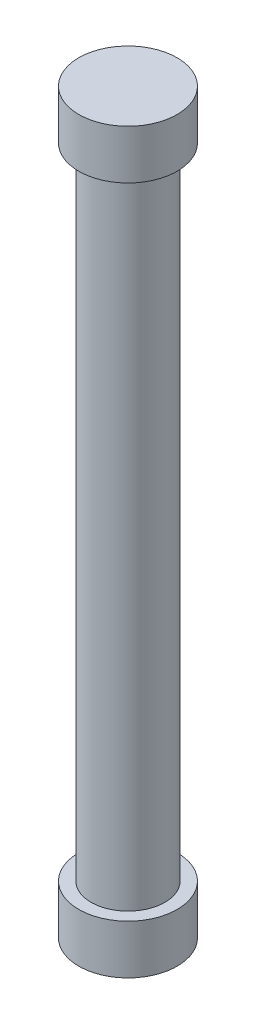
ISO-10303-21;
HEADER;
FILE_DESCRIPTION(('STEP AP214'),'2;1');
FILE_NAME('part.step','',(''),(''),'','','');
FILE_SCHEMA(('AUTOMOTIVE_DESIGN { 1 0 10303 214 1 1 1 1 }'));
ENDSEC;
DATA;
#1=APPLICATION_CONTEXT('core data for automotive mechanical design processes');
#2=APPLICATION_PROTOCOL_DEFINITION('international standard','automotive_design',2000,#1);
#3=PRODUCT_CONTEXT('',#1,'mechanical');
#4=PRODUCT('Part','Part','',(#3));
#5=PRODUCT_RELATED_PRODUCT_CATEGORY('part','',(#4));
#6=PRODUCT_DEFINITION_FORMATION('','',#4);
#7=PRODUCT_DEFINITION_CONTEXT('part definition',#1,'design');
#8=PRODUCT_DEFINITION('design','',#6,#7);
#9=PRODUCT_DEFINITION_SHAPE('','',#8);
#10=(LENGTH_UNIT() NAMED_UNIT(*) SI_UNIT(.MILLI.,.METRE.));
#11=(NAMED_UNIT(*) PLANE_ANGLE_UNIT() SI_UNIT($,.RADIAN.));
#12=(NAMED_UNIT(*) SI_UNIT($,.STERADIAN.) SOLID_ANGLE_UNIT());
#13=UNCERTAINTY_MEASURE_WITH_UNIT(LENGTH_MEASURE(1.E-05),#10,'distance_accuracy_value','');
#14=(GEOMETRIC_REPRESENTATION_CONTEXT(3) GLOBAL_UNCERTAINTY_ASSIGNED_CONTEXT((#13)) GLOBAL_UNIT_ASSIGNED_CONTEXT((#10,
#11,#12)) REPRESENTATION_CONTEXT('',''));
#15=CARTESIAN_POINT('',(0.,0.,0.));
#16=DIRECTION('',(0.,0.,1.));
#17=DIRECTION('',(1.,0.,0.));
#18=AXIS2_PLACEMENT_3D('',#15,#16,#17);
#19=CARTESIAN_POINT('',(-2.,26.025205425851,0.));
#20=DIRECTION('',(0.,1.,0.));
#21=DIRECTION('',(-1.,0.,0.));
#22=AXIS2_PLACEMENT_3D('',#19,#20,#21);
#23=PLANE('',#22);
#24=CARTESIAN_POINT('',(0.,26.025205425851,0.));
#25=DIRECTION('',(0.,1.,0.));
#26=DIRECTION('',(-1.,0.,0.));
#27=AXIS2_PLACEMENT_3D('',#24,#25,#26);
#28=CIRCLE('',#27,2.);
#29=CARTESIAN_POINT('',(-2.,26.025205425851,0.));
#30=VERTEX_POINT('',#29);
#31=EDGE_CURVE('E64',#30,#30,#28,.T.);
#32=ORIENTED_EDGE('',*,*,#31,.T.);
#33=EDGE_LOOP('',(#32));
#34=FACE_BOUND('',#33,.T.);
#35=ADVANCED_FACE('F37',(#34),#23,.T.);
#36=CARTESIAN_POINT('',(0.,-3.97479457414895,0.));
#37=DIRECTION('',(0.,-1.,0.));
#38=DIRECTION('',(1.,0.,0.));
#39=AXIS2_PLACEMENT_3D('',#36,#37,#38);
#40=PLANE('',#39);
#41=CARTESIAN_POINT('',(0.,-3.97479457414895,0.));
#42=DIRECTION('',(0.,1.,0.));
#43=DIRECTION('',(-1.,0.,0.));
#44=AXIS2_PLACEMENT_3D('',#41,#42,#43);
#45=CIRCLE('',#44,2.);
#46=CARTESIAN_POINT('',(-2.,-3.97479457414895,0.));
#47=VERTEX_POINT('',#46);
#48=EDGE_CURVE('E10',#47,#47,#45,.T.);
#49=ORIENTED_EDGE('',*,*,#48,.F.);
#50=EDGE_LOOP('',(#49));
#51=FACE_BOUND('',#50,.T.);
#52=ADVANCED_FACE('F82',(#51),#40,.T.);
#53=CARTESIAN_POINT('',(0.,26.025205425851,0.));
#54=DIRECTION('',(0.,1.,0.));
#55=DIRECTION('',(-1.,0.,0.));
#56=AXIS2_PLACEMENT_3D('',#53,#54,#55);
#57=CYLINDRICAL_SURFACE('',#56,2.);
#58=ORIENTED_EDGE('',*,*,#48,.T.);
#59=EDGE_LOOP('',(#58));
#60=FACE_BOUND('',#59,.T.);
#61=CARTESIAN_POINT('',(0.,-1.97479457414895,0.));
#62=DIRECTION('',(0.,1.,0.));
#63=DIRECTION('',(-1.,0.,0.));
#64=AXIS2_PLACEMENT_3D('',#61,#62,#63);
#65=CIRCLE('',#64,2.);
#66=CARTESIAN_POINT('',(-2.,-1.97479457414895,0.));
#67=VERTEX_POINT('',#66);
#68=EDGE_CURVE('E44',#67,#67,#65,.T.);
#69=ORIENTED_EDGE('',*,*,#68,.F.);
#70=EDGE_LOOP('',(#69));
#71=FACE_BOUND('',#70,.T.);
#72=ADVANCED_FACE('F86',(#60,#71),#57,.T.);
#73=CARTESIAN_POINT('',(-2.,-1.97479457414895,0.));
#74=DIRECTION('',(0.,1.,0.));
#75=DIRECTION('',(-1.,0.,0.));
#76=AXIS2_PLACEMENT_3D('',#73,#74,#75);
#77=PLANE('',#76);
#78=ORIENTED_EDGE('',*,*,#68,.T.);
#79=EDGE_LOOP('',(#78));
#80=FACE_BOUND('',#79,.T.);
#81=CARTESIAN_POINT('',(0.,-1.97479457414895,0.));
#82=DIRECTION('',(0.,1.,0.));
#83=DIRECTION('',(-1.,0.,0.));
#84=AXIS2_PLACEMENT_3D('',#81,#82,#83);
#85=CIRCLE('',#84,1.5);
#86=CARTESIAN_POINT('',(-1.5,-1.97479457414895,0.));
#87=VERTEX_POINT('',#86);
#88=EDGE_CURVE('E49',#87,#87,#85,.T.);
#89=ORIENTED_EDGE('',*,*,#88,.F.);
#90=EDGE_LOOP('',(#89));
#91=FACE_BOUND('',#90,.T.);
#92=ADVANCED_FACE('F91',(#80,#91),#77,.T.);
#93=CARTESIAN_POINT('',(0.,26.025205425851,0.));
#94=DIRECTION('',(0.,1.,0.));
#95=DIRECTION('',(-1.,0.,0.));
#96=AXIS2_PLACEMENT_3D('',#93,#94,#95);
#97=CYLINDRICAL_SURFACE('',#96,1.5);
#98=ORIENTED_EDGE('',*,*,#88,.T.);
#99=EDGE_LOOP('',(#98));
#100=FACE_BOUND('',#99,.T.);
#101=CARTESIAN_POINT('',(0.,24.025205425851,0.));
#102=DIRECTION('',(0.,1.,0.));
#103=DIRECTION('',(-1.,0.,0.));
#104=AXIS2_PLACEMENT_3D('',#101,#102,#103);
#105=CIRCLE('',#104,1.5);
#106=CARTESIAN_POINT('',(-1.5,24.025205425851,0.));
#107=VERTEX_POINT('',#106);
#108=EDGE_CURVE('E54',#107,#107,#105,.T.);
#109=ORIENTED_EDGE('',*,*,#108,.F.);
#110=EDGE_LOOP('',(#109));
#111=FACE_BOUND('',#110,.T.);
#112=ADVANCED_FACE('F78',(#100,#111),#97,.T.);
#113=CARTESIAN_POINT('',(-1.5,24.025205425851,0.));
#114=DIRECTION('',(0.,-1.,0.));
#115=DIRECTION('',(1.,0.,0.));
#116=AXIS2_PLACEMENT_3D('',#113,#114,#115);
#117=PLANE('',#116);
#118=ORIENTED_EDGE('',*,*,#108,.T.);
#119=EDGE_LOOP('',(#118));
#120=FACE_BOUND('',#119,.T.);
#121=CARTESIAN_POINT('',(0.,24.025205425851,0.));
#122=DIRECTION('',(0.,1.,0.));
#123=DIRECTION('',(-1.,0.,0.));
#124=AXIS2_PLACEMENT_3D('',#121,#122,#123);
#125=CIRCLE('',#124,2.);
#126=CARTESIAN_POINT('',(-2.,24.025205425851,0.));
#127=VERTEX_POINT('',#126);
#128=EDGE_CURVE('E60',#127,#127,#125,.T.);
#129=ORIENTED_EDGE('',*,*,#128,.F.);
#130=EDGE_LOOP('',(#129));
#131=FACE_BOUND('',#130,.T.);
#132=ADVANCED_FACE('F72',(#120,#131),#117,.T.);
#133=CARTESIAN_POINT('',(0.,26.025205425851,0.));
#134=DIRECTION('',(0.,1.,0.));
#135=DIRECTION('',(-1.,0.,0.));
#136=AXIS2_PLACEMENT_3D('',#133,#134,#135);
#137=CYLINDRICAL_SURFACE('',#136,2.);
#138=ORIENTED_EDGE('',*,*,#128,.T.);
#139=EDGE_LOOP('',(#138));
#140=FACE_BOUND('',#139,.T.);
#141=ORIENTED_EDGE('',*,*,#31,.F.);
#142=EDGE_LOOP('',(#141));
#143=FACE_BOUND('',#142,.T.);
#144=ADVANCED_FACE('F70',(#140,#143),#137,.T.);
#145=CLOSED_SHELL('',(#35,#52,#72,#92,#112,#132,#144));
#146=MANIFOLD_SOLID_BREP('B2',#145);
#147=ADVANCED_BREP_SHAPE_REPRESENTATION('',(#18,#146),#14);
#148=SHAPE_DEFINITION_REPRESENTATION(#9,#147);
ENDSEC;
END-ISO-10303-21;
